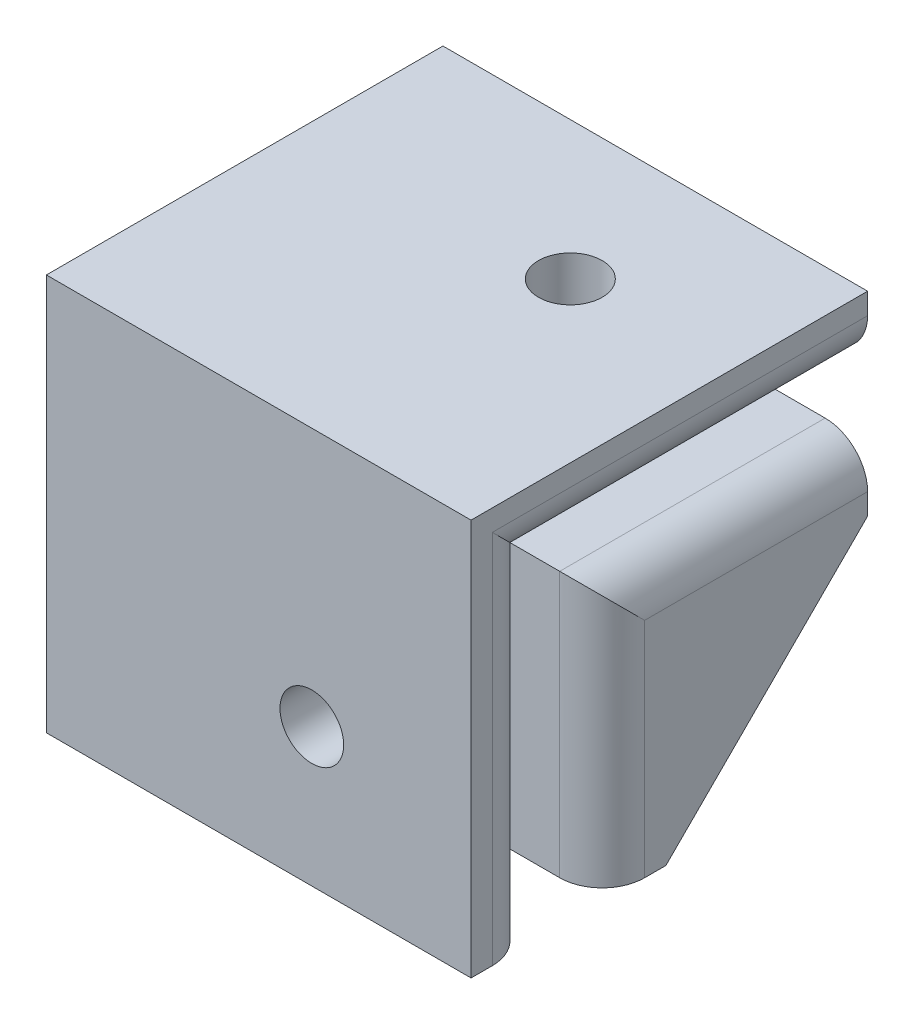
ISO-10303-21;
HEADER;
FILE_DESCRIPTION(('STEP AP214'),'2;1');
FILE_NAME('part.step','',(''),(''),'','','');
FILE_SCHEMA(('AUTOMOTIVE_DESIGN { 1 0 10303 214 1 1 1 1 }'));
ENDSEC;
DATA;
#1=APPLICATION_CONTEXT('core data for automotive mechanical design processes');
#2=APPLICATION_PROTOCOL_DEFINITION('international standard','automotive_design',2000,#1);
#3=PRODUCT_CONTEXT('',#1,'mechanical');
#4=PRODUCT('Part','Part','',(#3));
#5=PRODUCT_RELATED_PRODUCT_CATEGORY('part','',(#4));
#6=PRODUCT_DEFINITION_FORMATION('','',#4);
#7=PRODUCT_DEFINITION_CONTEXT('part definition',#1,'design');
#8=PRODUCT_DEFINITION('design','',#6,#7);
#9=PRODUCT_DEFINITION_SHAPE('','',#8);
#10=(LENGTH_UNIT() NAMED_UNIT(*) SI_UNIT(.MILLI.,.METRE.));
#11=(NAMED_UNIT(*) PLANE_ANGLE_UNIT() SI_UNIT($,.RADIAN.));
#12=(NAMED_UNIT(*) SI_UNIT($,.STERADIAN.) SOLID_ANGLE_UNIT());
#13=UNCERTAINTY_MEASURE_WITH_UNIT(LENGTH_MEASURE(1.E-05),#10,'distance_accuracy_value','');
#14=(GEOMETRIC_REPRESENTATION_CONTEXT(3) GLOBAL_UNCERTAINTY_ASSIGNED_CONTEXT((#13)) GLOBAL_UNIT_ASSIGNED_CONTEXT((#10,
#11,#12)) REPRESENTATION_CONTEXT('',''));
#15=CARTESIAN_POINT('',(0.,0.,0.));
#16=DIRECTION('',(0.,0.,1.));
#17=DIRECTION('',(1.,0.,0.));
#18=AXIS2_PLACEMENT_3D('',#15,#16,#17);
#19=CARTESIAN_POINT('',(12.5686292517777,-12.7041207821482,-6.07412073804247));
#20=DIRECTION('',(0.,1.,0.));
#21=DIRECTION('',(0.,0.,1.));
#22=AXIS2_PLACEMENT_3D('',#19,#20,#21);
#23=CYLINDRICAL_SURFACE('',#22,1.53);
#24=CARTESIAN_POINT('',(12.5686292517777,0.0458792178518012,-6.07412073804247));
#25=DIRECTION('',(0.,-1.,0.));
#26=DIRECTION('',(0.,0.,-1.));
#27=AXIS2_PLACEMENT_3D('',#24,#25,#26);
#28=CIRCLE('',#27,1.53);
#29=CARTESIAN_POINT('',(12.5686292517777,0.0458792178518012,-7.60412073804247));
#30=VERTEX_POINT('',#29);
#31=EDGE_CURVE('E165',#30,#30,#28,.T.);
#32=ORIENTED_EDGE('',*,*,#31,.F.);
#33=EDGE_LOOP('',(#32));
#34=FACE_BOUND('',#33,.T.);
#35=CARTESIAN_POINT('',(12.5686292517777,-6.0741207821482,-6.07412073804247));
#36=DIRECTION('',(0.,0.707106781186548,-0.707106781186547));
#37=DIRECTION('',(0.,0.707106781186547,0.707106781186548));
#38=AXIS2_PLACEMENT_3D('',#35,#36,#37);
#39=ELLIPSE('',#38,2.16374675043084,1.53);
#40=CARTESIAN_POINT('',(14.0986292517777,-6.0741207821482,-6.07412073804247));
#41=VERTEX_POINT('',#40);
#42=CARTESIAN_POINT('',(11.0386292517777,-6.0741207821482,-6.07412073804247));
#43=VERTEX_POINT('',#42);
#44=EDGE_CURVE('E52',#41,#43,#39,.F.);
#45=ORIENTED_EDGE('',*,*,#44,.T.);
#46=CARTESIAN_POINT('',(12.5686292517777,-6.0741207821482,-6.07412073804247));
#47=DIRECTION('',(0.,0.707106781186547,0.707106781186548));
#48=DIRECTION('',(0.,0.707106781186548,-0.707106781186547));
#49=AXIS2_PLACEMENT_3D('',#46,#47,#48);
#50=ELLIPSE('',#49,2.16374675043084,1.53);
#51=EDGE_CURVE('E11',#43,#41,#50,.F.);
#52=ORIENTED_EDGE('',*,*,#51,.T.);
#53=EDGE_LOOP('',(#45,#52));
#54=FACE_BOUND('',#53,.T.);
#55=ADVANCED_FACE('F38',(#34,#54),#23,.F.);
#56=CARTESIAN_POINT('',(20.2186292517777,0.0458792178518012,0.0458792619575329));
#57=DIRECTION('',(1.,0.,0.));
#58=DIRECTION('',(0.,0.,-1.));
#59=AXIS2_PLACEMENT_3D('',#56,#57,#58);
#60=PLANE('',#59);
#61=DIRECTION('',(0.,0.,-1.));
#62=VECTOR('',#61,1.);
#63=CARTESIAN_POINT('',(20.2186292517777,-12.7041207821482,0.0458792619575314));
#64=LINE('',#63,#62);
#65=CARTESIAN_POINT('',(20.2186292517777,-12.7041207821482,6.34437926195753));
#66=VERTEX_POINT('',#65);
#67=CARTESIAN_POINT('',(20.2186292517777,-12.7041207821482,5.32437926195753));
#68=VERTEX_POINT('',#67);
#69=EDGE_CURVE('E270',#66,#68,#64,.T.);
#70=ORIENTED_EDGE('',*,*,#69,.T.);
#71=DIRECTION('',(0.,-1.,0.));
#72=VECTOR('',#71,1.);
#73=CARTESIAN_POINT('',(20.2186292517777,3.2843792178518,5.32437926195753));
#74=LINE('',#73,#72);
#75=CARTESIAN_POINT('',(20.2186292517777,5.3243792178518,5.32437926195753));
#76=VERTEX_POINT('',#75);
#77=EDGE_CURVE('E200',#68,#76,#74,.F.);
#78=ORIENTED_EDGE('',*,*,#77,.T.);
#79=DIRECTION('',(0.,0.,1.));
#80=VECTOR('',#79,1.);
#81=CARTESIAN_POINT('',(20.2186292517777,5.3243792178518,-12.7041207380425));
#82=LINE('',#81,#80);
#83=CARTESIAN_POINT('',(20.2186292517777,5.3243792178518,-12.7041207380425));
#84=VERTEX_POINT('',#83);
#85=EDGE_CURVE('E203',#76,#84,#82,.F.);
#86=ORIENTED_EDGE('',*,*,#85,.T.);
#87=DIRECTION('',(0.,1.,0.));
#88=VECTOR('',#87,1.);
#89=CARTESIAN_POINT('',(20.2186292517777,-3.0141207821482,-12.7041207380425));
#90=LINE('',#89,#88);
#91=CARTESIAN_POINT('',(20.2186292517777,6.3443792178518,-12.7041207380425));
#92=VERTEX_POINT('',#91);
#93=EDGE_CURVE('E266',#84,#92,#90,.T.);
#94=ORIENTED_EDGE('',*,*,#93,.T.);
#95=DIRECTION('',(0.,0.,1.));
#96=VECTOR('',#95,1.);
#97=CARTESIAN_POINT('',(20.2186292517777,6.3443792178518,-12.7041207380425));
#98=LINE('',#97,#96);
#99=CARTESIAN_POINT('',(20.2186292517777,6.3443792178518,6.34437926195753));
#100=VERTEX_POINT('',#99);
#101=EDGE_CURVE('E259',#92,#100,#98,.T.);
#102=ORIENTED_EDGE('',*,*,#101,.T.);
#103=DIRECTION('',(0.,-1.,0.));
#104=VECTOR('',#103,1.);
#105=CARTESIAN_POINT('',(20.2186292517777,6.3443792178518,6.34437926195753));
#106=LINE('',#105,#104);
#107=EDGE_CURVE('E236',#100,#66,#106,.T.);
#108=ORIENTED_EDGE('',*,*,#107,.T.);
#109=EDGE_LOOP('',(#70,#78,#86,#94,#102,#108));
#110=FACE_BOUND('',#109,.T.);
#111=ADVANCED_FACE('F364',(#110),#60,.T.);
#112=CARTESIAN_POINT('',(20.2186292517777,-12.7041207821482,-3.01412073804247));
#113=DIRECTION('',(0.,0.707106781186547,0.707106781186548));
#114=DIRECTION('',(0.,-0.707106781186548,0.707106781186547));
#115=AXIS2_PLACEMENT_3D('',#112,#113,#114);
#116=PLANE('',#115);
#117=CARTESIAN_POINT('',(12.5686292517777,-6.0741207821482,-9.64412073804247));
#118=DIRECTION('',(0.,0.707106781186547,0.707106781186548));
#119=DIRECTION('',(0.,-0.707106781186548,0.707106781186547));
#120=AXIS2_PLACEMENT_3D('',#117,#118,#119);
#121=ELLIPSE('',#120,2.16374675043084,1.53);
#122=CARTESIAN_POINT('',(12.5686292517777,-7.6041207821482,-8.11412073804247));
#123=VERTEX_POINT('',#122);
#124=EDGE_CURVE('E327',#123,#123,#121,.T.);
#125=ORIENTED_EDGE('',*,*,#124,.T.);
#126=EDGE_LOOP('',(#125));
#127=FACE_BOUND('',#126,.T.);
#128=CARTESIAN_POINT('',(12.5686292517777,-9.6441207821482,-6.07412073804247));
#129=DIRECTION('',(0.,0.707106781186547,0.707106781186548));
#130=DIRECTION('',(0.,0.707106781186548,-0.707106781186547));
#131=AXIS2_PLACEMENT_3D('',#128,#129,#130);
#132=ELLIPSE('',#131,2.16374675043084,1.53);
#133=CARTESIAN_POINT('',(12.5686292517777,-8.1141207821482,-7.60412073804247));
#134=VERTEX_POINT('',#133);
#135=EDGE_CURVE('E175',#134,#134,#132,.T.);
#136=ORIENTED_EDGE('',*,*,#135,.T.);
#137=EDGE_LOOP('',(#136));
#138=FACE_BOUND('',#137,.T.);
#139=DIRECTION('',(0.,0.707106781186548,-0.707106781186547));
#140=VECTOR('',#139,1.);
#141=CARTESIAN_POINT('',(-0.181370748222278,-12.7041207821482,-3.01412073804247));
#142=LINE('',#141,#140);
#143=CARTESIAN_POINT('',(-0.181370748222278,-12.7041207821482,-3.01412073804247));
#144=VERTEX_POINT('',#143);
#145=CARTESIAN_POINT('',(-0.181370748222278,-3.0141207821482,-12.7041207380425));
#146=VERTEX_POINT('',#145);
#147=EDGE_CURVE('E251',#144,#146,#142,.T.);
#148=ORIENTED_EDGE('',*,*,#147,.T.);
#149=DIRECTION('',(-1.,0.,0.));
#150=VECTOR('',#149,1.);
#151=CARTESIAN_POINT('',(20.2186292517777,-3.0141207821482,-12.7041207380425));
#152=LINE('',#151,#150);
#153=CARTESIAN_POINT('',(20.2186292517777,-3.0141207821482,-12.7041207380425));
#154=VERTEX_POINT('',#153);
#155=EDGE_CURVE('E220',#154,#146,#152,.T.);
#156=ORIENTED_EDGE('',*,*,#155,.F.);
#157=DIRECTION('',(0.,0.707106781186548,-0.707106781186547));
#158=VECTOR('',#157,1.);
#159=CARTESIAN_POINT('',(20.2186292517777,-12.7041207821482,-3.01412073804247));
#160=LINE('',#159,#158);
#161=CARTESIAN_POINT('',(20.2186292517777,-12.7041207821482,-3.01412073804247));
#162=VERTEX_POINT('',#161);
#163=EDGE_CURVE('E267',#162,#154,#160,.T.);
#164=ORIENTED_EDGE('',*,*,#163,.F.);
#165=DIRECTION('',(-1.,0.,0.));
#166=VECTOR('',#165,1.);
#167=CARTESIAN_POINT('',(20.2186292517777,-12.7041207821482,-3.01412073804247));
#168=LINE('',#167,#166);
#169=EDGE_CURVE('E216',#162,#144,#168,.T.);
#170=ORIENTED_EDGE('',*,*,#169,.T.);
#171=EDGE_LOOP('',(#148,#156,#164,#170));
#172=FACE_BOUND('',#171,.T.);
#173=ADVANCED_FACE('F371',(#127,#138,#172),#116,.F.);
#174=CARTESIAN_POINT('',(20.2186292517777,3.2843792178518,-12.7041207380425));
#175=DIRECTION('',(0.,0.,1.));
#176=DIRECTION('',(1.,0.,0.));
#177=AXIS2_PLACEMENT_3D('',#174,#175,#176);
#178=PLANE('',#177);
#179=DIRECTION('',(1.,0.,0.));
#180=VECTOR('',#179,1.);
#181=CARTESIAN_POINT('',(4.91862925177772,0.0458792178518012,-12.7041207380425));
#182=LINE('',#181,#180);
#183=CARTESIAN_POINT('',(4.91862925177772,0.0458792178518012,-12.7041207380425));
#184=VERTEX_POINT('',#183);
#185=CARTESIAN_POINT('',(18.1786292517777,0.0458792178518012,-12.7041207380425));
#186=VERTEX_POINT('',#185);
#187=EDGE_CURVE('E287',#184,#186,#182,.T.);
#188=ORIENTED_EDGE('',*,*,#187,.T.);
#189=CARTESIAN_POINT('',(18.1786292517777,-1.9941207821482,-12.7041207380425));
#190=DIRECTION('',(0.,0.,1.));
#191=DIRECTION('',(1.,0.,0.));
#192=AXIS2_PLACEMENT_3D('',#189,#190,#191);
#193=CIRCLE('',#192,2.04);
#194=CARTESIAN_POINT('',(20.2186292517777,-1.9941207821482,-12.7041207380425));
#195=VERTEX_POINT('',#194);
#196=EDGE_CURVE('E182',#186,#195,#193,.F.);
#197=ORIENTED_EDGE('',*,*,#196,.T.);
#198=EDGE_CURVE('E262',#154,#195,#90,.T.);
#199=ORIENTED_EDGE('',*,*,#198,.F.);
#200=ORIENTED_EDGE('',*,*,#155,.T.);
#201=DIRECTION('',(0.,1.,0.));
#202=VECTOR('',#201,1.);
#203=CARTESIAN_POINT('',(-0.181370748222278,3.2843792178518,-12.7041207380425));
#204=LINE('',#203,#202);
#205=CARTESIAN_POINT('',(-0.181370748222278,6.3443792178518,-12.7041207380425));
#206=VERTEX_POINT('',#205);
#207=EDGE_CURVE('E248',#146,#206,#204,.T.);
#208=ORIENTED_EDGE('',*,*,#207,.T.);
#209=DIRECTION('',(-1.,0.,0.));
#210=VECTOR('',#209,1.);
#211=CARTESIAN_POINT('',(20.2186292517777,6.3443792178518,-12.7041207380425));
#212=LINE('',#211,#210);
#213=EDGE_CURVE('E224',#92,#206,#212,.T.);
#214=ORIENTED_EDGE('',*,*,#213,.F.);
#215=ORIENTED_EDGE('',*,*,#93,.F.);
#216=CARTESIAN_POINT('',(18.1786292517777,5.3243792178518,-12.7041207380425));
#217=DIRECTION('',(0.,0.,1.));
#218=DIRECTION('',(1.,0.,0.));
#219=AXIS2_PLACEMENT_3D('',#216,#217,#218);
#220=CIRCLE('',#219,2.04);
#221=CARTESIAN_POINT('',(18.1786292517777,3.2843792178518,-12.7041207380425));
#222=VERTEX_POINT('',#221);
#223=EDGE_CURVE('E60',#84,#222,#220,.F.);
#224=ORIENTED_EDGE('',*,*,#223,.T.);
#225=DIRECTION('',(1.,0.,0.));
#226=VECTOR('',#225,1.);
#227=CARTESIAN_POINT('',(4.91862925177772,3.2843792178518,-12.7041207380425));
#228=LINE('',#227,#226);
#229=CARTESIAN_POINT('',(4.91862925177772,3.2843792178518,-12.7041207380425));
#230=VERTEX_POINT('',#229);
#231=EDGE_CURVE('E291',#230,#222,#228,.T.);
#232=ORIENTED_EDGE('',*,*,#231,.F.);
#233=DIRECTION('',(0.,1.,0.));
#234=VECTOR('',#233,1.);
#235=CARTESIAN_POINT('',(4.91862925177772,0.0458792178518012,-12.7041207380425));
#236=LINE('',#235,#234);
#237=EDGE_CURVE('E300',#184,#230,#236,.T.);
#238=ORIENTED_EDGE('',*,*,#237,.F.);
#239=EDGE_LOOP('',(#188,#197,#199,#200,#208,#214,#215,#224,#232,#238));
#240=FACE_BOUND('',#239,.T.);
#241=ADVANCED_FACE('F374',(#240),#178,.F.);
#242=CARTESIAN_POINT('',(20.2186292517777,6.3443792178518,-12.7041207380425));
#243=DIRECTION('',(0.,-1.,0.));
#244=DIRECTION('',(0.,0.,-1.));
#245=AXIS2_PLACEMENT_3D('',#242,#243,#244);
#246=PLANE('',#245);
#247=CARTESIAN_POINT('',(12.5686292517777,6.3443792178518,-6.07412073804247));
#248=DIRECTION('',(0.,1.,0.));
#249=DIRECTION('',(0.,0.,1.));
#250=AXIS2_PLACEMENT_3D('',#247,#248,#249);
#251=CIRCLE('',#250,1.53);
#252=CARTESIAN_POINT('',(12.5686292517777,6.3443792178518,-4.54412073804247));
#253=VERTEX_POINT('',#252);
#254=EDGE_CURVE('E170',#253,#253,#251,.T.);
#255=ORIENTED_EDGE('',*,*,#254,.F.);
#256=EDGE_LOOP('',(#255));
#257=FACE_BOUND('',#256,.T.);
#258=DIRECTION('',(0.,0.,1.));
#259=VECTOR('',#258,1.);
#260=CARTESIAN_POINT('',(-0.181370748222278,6.3443792178518,-12.7041207380425));
#261=LINE('',#260,#259);
#262=CARTESIAN_POINT('',(-0.181370748222278,6.3443792178518,6.34437926195753));
#263=VERTEX_POINT('',#262);
#264=EDGE_CURVE('E245',#206,#263,#261,.T.);
#265=ORIENTED_EDGE('',*,*,#264,.T.);
#266=DIRECTION('',(-1.,0.,0.));
#267=VECTOR('',#266,1.);
#268=CARTESIAN_POINT('',(20.2186292517777,6.3443792178518,6.34437926195753));
#269=LINE('',#268,#267);
#270=EDGE_CURVE('E228',#100,#263,#269,.T.);
#271=ORIENTED_EDGE('',*,*,#270,.F.);
#272=ORIENTED_EDGE('',*,*,#101,.F.);
#273=ORIENTED_EDGE('',*,*,#213,.T.);
#274=EDGE_LOOP('',(#265,#271,#272,#273));
#275=FACE_BOUND('',#274,.T.);
#276=ADVANCED_FACE('F351',(#257,#275),#246,.F.);
#277=CARTESIAN_POINT('',(20.2186292517777,6.3443792178518,6.34437926195753));
#278=DIRECTION('',(0.,0.,-1.));
#279=DIRECTION('',(0.,1.,0.));
#280=AXIS2_PLACEMENT_3D('',#277,#278,#279);
#281=PLANE('',#280);
#282=CARTESIAN_POINT('',(12.5686292517777,-6.0741207821482,6.34437926195753));
#283=DIRECTION('',(0.,0.,1.));
#284=DIRECTION('',(1.,0.,0.));
#285=AXIS2_PLACEMENT_3D('',#282,#283,#284);
#286=CIRCLE('',#285,1.53);
#287=CARTESIAN_POINT('',(14.0986292517777,-6.0741207821482,6.34437926195753));
#288=VERTEX_POINT('',#287);
#289=EDGE_CURVE('E339',#288,#288,#286,.T.);
#290=ORIENTED_EDGE('',*,*,#289,.F.);
#291=EDGE_LOOP('',(#290));
#292=FACE_BOUND('',#291,.T.);
#293=DIRECTION('',(0.,-1.,0.));
#294=VECTOR('',#293,1.);
#295=CARTESIAN_POINT('',(-0.181370748222278,6.3443792178518,6.34437926195753));
#296=LINE('',#295,#294);
#297=CARTESIAN_POINT('',(-0.181370748222278,-12.7041207821482,6.34437926195753));
#298=VERTEX_POINT('',#297);
#299=EDGE_CURVE('E241',#263,#298,#296,.T.);
#300=ORIENTED_EDGE('',*,*,#299,.T.);
#301=DIRECTION('',(-1.,0.,0.));
#302=VECTOR('',#301,1.);
#303=CARTESIAN_POINT('',(20.2186292517777,-12.7041207821482,6.34437926195753));
#304=LINE('',#303,#302);
#305=EDGE_CURVE('E232',#66,#298,#304,.T.);
#306=ORIENTED_EDGE('',*,*,#305,.F.);
#307=ORIENTED_EDGE('',*,*,#107,.F.);
#308=ORIENTED_EDGE('',*,*,#270,.T.);
#309=EDGE_LOOP('',(#300,#306,#307,#308));
#310=FACE_BOUND('',#309,.T.);
#311=ADVANCED_FACE('F347',(#292,#310),#281,.F.);
#312=CARTESIAN_POINT('',(20.2186292517777,-12.7041207821482,0.0458792619575314));
#313=DIRECTION('',(0.,1.,0.));
#314=DIRECTION('',(0.,0.,1.));
#315=AXIS2_PLACEMENT_3D('',#312,#313,#314);
#316=PLANE('',#315);
#317=DIRECTION('',(1.,0.,0.));
#318=VECTOR('',#317,1.);
#319=CARTESIAN_POINT('',(4.91862925177772,-12.7041207821482,3.28437926195753));
#320=LINE('',#319,#318);
#321=CARTESIAN_POINT('',(4.91862925177772,-12.7041207821482,3.28437926195753));
#322=VERTEX_POINT('',#321);
#323=CARTESIAN_POINT('',(18.1786292517777,-12.7041207821482,3.28437926195753));
#324=VERTEX_POINT('',#323);
#325=EDGE_CURVE('E274',#322,#324,#320,.T.);
#326=ORIENTED_EDGE('',*,*,#325,.T.);
#327=CARTESIAN_POINT('',(18.1786292517777,-12.7041207821482,5.32437926195753));
#328=DIRECTION('',(0.,1.,0.));
#329=DIRECTION('',(0.,0.,1.));
#330=AXIS2_PLACEMENT_3D('',#327,#328,#329);
#331=CIRCLE('',#330,2.04);
#332=EDGE_CURVE('E206',#324,#68,#331,.F.);
#333=ORIENTED_EDGE('',*,*,#332,.T.);
#334=ORIENTED_EDGE('',*,*,#69,.F.);
#335=ORIENTED_EDGE('',*,*,#305,.T.);
#336=DIRECTION('',(0.,0.,-1.));
#337=VECTOR('',#336,1.);
#338=CARTESIAN_POINT('',(-0.181370748222278,-12.7041207821482,0.0458792619575314));
#339=LINE('',#338,#337);
#340=EDGE_CURVE('E237',#298,#144,#339,.T.);
#341=ORIENTED_EDGE('',*,*,#340,.T.);
#342=ORIENTED_EDGE('',*,*,#169,.F.);
#343=CARTESIAN_POINT('',(20.2186292517777,-12.7041207821482,-1.99412073804247));
#344=VERTEX_POINT('',#343);
#345=EDGE_CURVE('E240',#344,#162,#64,.T.);
#346=ORIENTED_EDGE('',*,*,#345,.F.);
#347=CARTESIAN_POINT('',(18.1786292517777,-12.7041207821482,-1.99412073804247));
#348=DIRECTION('',(0.,1.,0.));
#349=DIRECTION('',(0.,0.,1.));
#350=AXIS2_PLACEMENT_3D('',#347,#348,#349);
#351=CIRCLE('',#350,2.04);
#352=CARTESIAN_POINT('',(18.1786292517777,-12.7041207821482,0.0458792619575314));
#353=VERTEX_POINT('',#352);
#354=EDGE_CURVE('E209',#344,#353,#351,.F.);
#355=ORIENTED_EDGE('',*,*,#354,.T.);
#356=DIRECTION('',(1.,0.,0.));
#357=VECTOR('',#356,1.);
#358=CARTESIAN_POINT('',(4.91862925177772,-12.7041207821482,0.0458792619575314));
#359=LINE('',#358,#357);
#360=CARTESIAN_POINT('',(4.91862925177772,-12.7041207821482,0.0458792619575314));
#361=VERTEX_POINT('',#360);
#362=EDGE_CURVE('E278',#361,#353,#359,.T.);
#363=ORIENTED_EDGE('',*,*,#362,.F.);
#364=DIRECTION('',(0.,0.,-1.));
#365=VECTOR('',#364,1.);
#366=CARTESIAN_POINT('',(4.91862925177772,-12.7041207821482,3.28437926195753));
#367=LINE('',#366,#365);
#368=EDGE_CURVE('E311',#322,#361,#367,.T.);
#369=ORIENTED_EDGE('',*,*,#368,.F.);
#370=EDGE_LOOP('',(#326,#333,#334,#335,#341,#342,#346,#355,#363,#369));
#371=FACE_BOUND('',#370,.T.);
#372=ADVANCED_FACE('F350',(#371),#316,.F.);
#373=DIRECTION('',(0.,0.,-1.));
#374=VECTOR('',#373,1.);
#375=CARTESIAN_POINT('',(20.2186292517777,-1.9941207821482,0.0458792619575329));
#376=LINE('',#375,#374);
#377=CARTESIAN_POINT('',(20.2186292517777,-1.9941207821482,-1.99412073804247));
#378=VERTEX_POINT('',#377);
#379=EDGE_CURVE('E193',#195,#378,#376,.F.);
#380=ORIENTED_EDGE('',*,*,#379,.T.);
#381=DIRECTION('',(0.,1.,0.));
#382=VECTOR('',#381,1.);
#383=CARTESIAN_POINT('',(20.2186292517777,-12.7041207821482,-1.99412073804247));
#384=LINE('',#383,#382);
#385=EDGE_CURVE('E190',#378,#344,#384,.F.);
#386=ORIENTED_EDGE('',*,*,#385,.T.);
#387=ORIENTED_EDGE('',*,*,#345,.T.);
#388=ORIENTED_EDGE('',*,*,#163,.T.);
#389=ORIENTED_EDGE('',*,*,#198,.T.);
#390=EDGE_LOOP('',(#380,#386,#387,#388,#389));
#391=FACE_BOUND('',#390,.T.);
#392=ADVANCED_FACE('F378',(#391),#60,.T.);
#393=CARTESIAN_POINT('',(-0.181370748222278,0.0458792178518012,0.0458792619575329));
#394=DIRECTION('',(1.,0.,0.));
#395=DIRECTION('',(0.,0.,-1.));
#396=AXIS2_PLACEMENT_3D('',#393,#394,#395);
#397=PLANE('',#396);
#398=ORIENTED_EDGE('',*,*,#147,.F.);
#399=ORIENTED_EDGE('',*,*,#340,.F.);
#400=ORIENTED_EDGE('',*,*,#299,.F.);
#401=ORIENTED_EDGE('',*,*,#264,.F.);
#402=ORIENTED_EDGE('',*,*,#207,.F.);
#403=EDGE_LOOP('',(#398,#399,#400,#401,#402));
#404=FACE_BOUND('',#403,.T.);
#405=ADVANCED_FACE('F368',(#404),#397,.F.);
#406=CARTESIAN_POINT('',(4.91862925177772,3.2843792178518,3.28437926195753));
#407=DIRECTION('',(0.,0.,1.));
#408=DIRECTION('',(0.,-1.,0.));
#409=AXIS2_PLACEMENT_3D('',#406,#407,#408);
#410=PLANE('',#409);
#411=CARTESIAN_POINT('',(12.5686292517777,-6.0741207821482,3.28437926195753));
#412=DIRECTION('',(0.,0.,1.));
#413=DIRECTION('',(0.,-1.,0.));
#414=AXIS2_PLACEMENT_3D('',#411,#412,#413);
#415=CIRCLE('',#414,1.53);
#416=CARTESIAN_POINT('',(12.5686292517777,-7.6041207821482,3.28437926195753));
#417=VERTEX_POINT('',#416);
#418=EDGE_CURVE('E331',#417,#417,#415,.T.);
#419=ORIENTED_EDGE('',*,*,#418,.T.);
#420=EDGE_LOOP('',(#419));
#421=FACE_BOUND('',#420,.T.);
#422=DIRECTION('',(1.,0.,0.));
#423=VECTOR('',#422,1.);
#424=CARTESIAN_POINT('',(4.91862925177772,3.2843792178518,3.28437926195753));
#425=LINE('',#424,#423);
#426=CARTESIAN_POINT('',(4.91862925177772,3.2843792178518,3.28437926195753));
#427=VERTEX_POINT('',#426);
#428=CARTESIAN_POINT('',(18.1786292517777,3.2843792178518,3.28437926195753));
#429=VERTEX_POINT('',#428);
#430=EDGE_CURVE('E255',#427,#429,#425,.T.);
#431=ORIENTED_EDGE('',*,*,#430,.T.);
#432=DIRECTION('',(0.,-1.,0.));
#433=VECTOR('',#432,1.);
#434=CARTESIAN_POINT('',(18.1786292517777,-12.7041207821482,3.28437926195753));
#435=LINE('',#434,#433);
#436=EDGE_CURVE('E212',#429,#324,#435,.T.);
#437=ORIENTED_EDGE('',*,*,#436,.T.);
#438=ORIENTED_EDGE('',*,*,#325,.F.);
#439=DIRECTION('',(0.,-1.,0.));
#440=VECTOR('',#439,1.);
#441=CARTESIAN_POINT('',(4.91862925177772,3.2843792178518,3.28437926195753));
#442=LINE('',#441,#440);
#443=EDGE_CURVE('E179',#427,#322,#442,.T.);
#444=ORIENTED_EDGE('',*,*,#443,.F.);
#445=EDGE_LOOP('',(#431,#437,#438,#444));
#446=FACE_BOUND('',#445,.T.);
#447=ADVANCED_FACE('F399',(#421,#446),#410,.F.);
#448=CARTESIAN_POINT('',(4.91862925177772,3.2843792178518,-12.7041207380425));
#449=DIRECTION('',(0.,1.,0.));
#450=DIRECTION('',(0.,0.,1.));
#451=AXIS2_PLACEMENT_3D('',#448,#449,#450);
#452=PLANE('',#451);
#453=CARTESIAN_POINT('',(12.5686292517777,3.2843792178518,-6.07412073804247));
#454=DIRECTION('',(0.,1.,0.));
#455=DIRECTION('',(0.,0.,1.));
#456=AXIS2_PLACEMENT_3D('',#453,#454,#455);
#457=CIRCLE('',#456,1.53);
#458=CARTESIAN_POINT('',(12.5686292517777,3.2843792178518,-4.54412073804247));
#459=VERTEX_POINT('',#458);
#460=EDGE_CURVE('E169',#459,#459,#457,.T.);
#461=ORIENTED_EDGE('',*,*,#460,.T.);
#462=EDGE_LOOP('',(#461));
#463=FACE_BOUND('',#462,.T.);
#464=ORIENTED_EDGE('',*,*,#231,.T.);
#465=DIRECTION('',(0.,0.,1.));
#466=VECTOR('',#465,1.);
#467=CARTESIAN_POINT('',(18.1786292517777,3.2843792178518,3.28437926195753));
#468=LINE('',#467,#466);
#469=EDGE_CURVE('E159',#222,#429,#468,.T.);
#470=ORIENTED_EDGE('',*,*,#469,.T.);
#471=ORIENTED_EDGE('',*,*,#430,.F.);
#472=DIRECTION('',(0.,0.,1.));
#473=VECTOR('',#472,1.);
#474=CARTESIAN_POINT('',(4.91862925177772,3.2843792178518,-12.7041207380425));
#475=LINE('',#474,#473);
#476=EDGE_CURVE('E279',#230,#427,#475,.T.);
#477=ORIENTED_EDGE('',*,*,#476,.F.);
#478=EDGE_LOOP('',(#464,#470,#471,#477));
#479=FACE_BOUND('',#478,.T.);
#480=ADVANCED_FACE('F409',(#463,#479),#452,.F.);
#481=CARTESIAN_POINT('',(4.91862925177772,0.0458792178518012,0.0458792619575329));
#482=DIRECTION('',(0.,-1.,0.));
#483=DIRECTION('',(0.,0.,-1.));
#484=AXIS2_PLACEMENT_3D('',#481,#482,#483);
#485=PLANE('',#484);
#486=ORIENTED_EDGE('',*,*,#31,.T.);
#487=EDGE_LOOP('',(#486));
#488=FACE_BOUND('',#487,.T.);
#489=DIRECTION('',(1.,0.,0.));
#490=VECTOR('',#489,1.);
#491=CARTESIAN_POINT('',(4.91862925177772,0.0458792178518012,0.0458792619575329));
#492=LINE('',#491,#490);
#493=CARTESIAN_POINT('',(4.91862925177772,0.0458792178518012,0.0458792619575329));
#494=VERTEX_POINT('',#493);
#495=CARTESIAN_POINT('',(18.1786292517777,0.0458792178518012,0.0458792619575329));
#496=VERTEX_POINT('',#495);
#497=EDGE_CURVE('E283',#494,#496,#492,.T.);
#498=ORIENTED_EDGE('',*,*,#497,.T.);
#499=DIRECTION('',(0.,0.,-1.));
#500=VECTOR('',#499,1.);
#501=CARTESIAN_POINT('',(18.1786292517777,0.0458792178518012,-12.7041207380425));
#502=LINE('',#501,#500);
#503=EDGE_CURVE('E187',#496,#186,#502,.T.);
#504=ORIENTED_EDGE('',*,*,#503,.T.);
#505=ORIENTED_EDGE('',*,*,#187,.F.);
#506=DIRECTION('',(0.,0.,-1.));
#507=VECTOR('',#506,1.);
#508=CARTESIAN_POINT('',(4.91862925177772,0.0458792178518012,0.0458792619575329));
#509=LINE('',#508,#507);
#510=EDGE_CURVE('E303',#494,#184,#509,.T.);
#511=ORIENTED_EDGE('',*,*,#510,.F.);
#512=EDGE_LOOP('',(#498,#504,#505,#511));
#513=FACE_BOUND('',#512,.T.);
#514=ADVANCED_FACE('F413',(#488,#513),#485,.F.);
#515=CARTESIAN_POINT('',(4.91862925177772,-12.7041207821482,0.0458792619575314));
#516=DIRECTION('',(0.,0.,-1.));
#517=DIRECTION('',(0.,1.,0.));
#518=AXIS2_PLACEMENT_3D('',#515,#516,#517);
#519=PLANE('',#518);
#520=CARTESIAN_POINT('',(12.5686292517777,-6.0741207821482,0.0458792619575312));
#521=DIRECTION('',(0.,0.,-1.));
#522=DIRECTION('',(0.,1.,0.));
#523=AXIS2_PLACEMENT_3D('',#520,#521,#522);
#524=CIRCLE('',#523,1.53);
#525=CARTESIAN_POINT('',(12.5686292517777,-4.5441207821482,0.0458792619575314));
#526=VERTEX_POINT('',#525);
#527=EDGE_CURVE('E335',#526,#526,#524,.T.);
#528=ORIENTED_EDGE('',*,*,#527,.T.);
#529=EDGE_LOOP('',(#528));
#530=FACE_BOUND('',#529,.T.);
#531=ORIENTED_EDGE('',*,*,#362,.T.);
#532=DIRECTION('',(0.,1.,0.));
#533=VECTOR('',#532,1.);
#534=CARTESIAN_POINT('',(18.1786292517777,0.045879217851801,0.0458792619575329));
#535=LINE('',#534,#533);
#536=EDGE_CURVE('E196',#353,#496,#535,.T.);
#537=ORIENTED_EDGE('',*,*,#536,.T.);
#538=ORIENTED_EDGE('',*,*,#497,.F.);
#539=DIRECTION('',(0.,1.,0.));
#540=VECTOR('',#539,1.);
#541=CARTESIAN_POINT('',(4.91862925177772,-12.7041207821482,0.0458792619575314));
#542=LINE('',#541,#540);
#543=EDGE_CURVE('E307',#361,#494,#542,.T.);
#544=ORIENTED_EDGE('',*,*,#543,.F.);
#545=EDGE_LOOP('',(#531,#537,#538,#544));
#546=FACE_BOUND('',#545,.T.);
#547=ADVANCED_FACE('F393',(#530,#546),#519,.F.);
#548=CARTESIAN_POINT('',(4.91862925177772,0.0458792178518012,0.0458792619575329));
#549=DIRECTION('',(1.,0.,0.));
#550=DIRECTION('',(0.,0.,-1.));
#551=AXIS2_PLACEMENT_3D('',#548,#549,#550);
#552=PLANE('',#551);
#553=ORIENTED_EDGE('',*,*,#443,.T.);
#554=ORIENTED_EDGE('',*,*,#368,.T.);
#555=ORIENTED_EDGE('',*,*,#543,.T.);
#556=ORIENTED_EDGE('',*,*,#510,.T.);
#557=ORIENTED_EDGE('',*,*,#237,.T.);
#558=ORIENTED_EDGE('',*,*,#476,.T.);
#559=EDGE_LOOP('',(#553,#554,#555,#556,#557,#558));
#560=FACE_BOUND('',#559,.T.);
#561=ADVANCED_FACE('F396',(#560),#552,.T.);
#562=CARTESIAN_POINT('',(18.1786292517777,5.3243792178518,-12.7041207380425));
#563=DIRECTION('',(0.,0.,-1.));
#564=DIRECTION('',(-1.,0.,0.));
#565=AXIS2_PLACEMENT_3D('',#562,#563,#564);
#566=CYLINDRICAL_SURFACE('',#565,2.04);
#567=ORIENTED_EDGE('',*,*,#223,.F.);
#568=ORIENTED_EDGE('',*,*,#85,.F.);
#569=CARTESIAN_POINT('',(18.1786292517777,5.3243792178518,5.32437926195753));
#570=DIRECTION('',(0.,0.707106781186547,-0.707106781186547));
#571=DIRECTION('',(0.,0.707106781186547,0.707106781186547));
#572=AXIS2_PLACEMENT_3D('',#569,#570,#571);
#573=ELLIPSE('',#572,2.88499566724111,2.04);
#574=EDGE_CURVE('E174',#429,#76,#573,.F.);
#575=ORIENTED_EDGE('',*,*,#574,.F.);
#576=ORIENTED_EDGE('',*,*,#469,.F.);
#577=EDGE_LOOP('',(#567,#568,#575,#576));
#578=FACE_BOUND('',#577,.T.);
#579=ADVANCED_FACE('F406',(#578),#566,.T.);
#580=CARTESIAN_POINT('',(18.1786292517777,3.2843792178518,5.32437926195753));
#581=DIRECTION('',(0.,1.,0.));
#582=DIRECTION('',(0.,0.,1.));
#583=AXIS2_PLACEMENT_3D('',#580,#581,#582);
#584=CYLINDRICAL_SURFACE('',#583,2.04);
#585=ORIENTED_EDGE('',*,*,#574,.T.);
#586=ORIENTED_EDGE('',*,*,#77,.F.);
#587=ORIENTED_EDGE('',*,*,#332,.F.);
#588=ORIENTED_EDGE('',*,*,#436,.F.);
#589=EDGE_LOOP('',(#585,#586,#587,#588));
#590=FACE_BOUND('',#589,.T.);
#591=ADVANCED_FACE('F403',(#590),#584,.T.);
#592=CARTESIAN_POINT('',(18.1786292517777,-1.9941207821482,0.0458792619575329));
#593=DIRECTION('',(0.,0.,1.));
#594=DIRECTION('',(0.,-1.,0.));
#595=AXIS2_PLACEMENT_3D('',#592,#593,#594);
#596=CYLINDRICAL_SURFACE('',#595,2.04);
#597=ORIENTED_EDGE('',*,*,#196,.F.);
#598=ORIENTED_EDGE('',*,*,#503,.F.);
#599=CARTESIAN_POINT('',(18.1786292517777,-1.9941207821482,-1.99412073804247));
#600=DIRECTION('',(0.,-0.707106781186548,0.707106781186547));
#601=DIRECTION('',(0.,0.707106781186547,0.707106781186548));
#602=AXIS2_PLACEMENT_3D('',#599,#600,#601);
#603=ELLIPSE('',#602,2.88499566724111,2.04);
#604=EDGE_CURVE('E171',#378,#496,#603,.T.);
#605=ORIENTED_EDGE('',*,*,#604,.F.);
#606=ORIENTED_EDGE('',*,*,#379,.F.);
#607=EDGE_LOOP('',(#597,#598,#605,#606));
#608=FACE_BOUND('',#607,.T.);
#609=ADVANCED_FACE('F40',(#608),#596,.T.);
#610=CARTESIAN_POINT('',(18.1786292517777,-12.7041207821482,-1.99412073804247));
#611=DIRECTION('',(0.,-1.,0.));
#612=DIRECTION('',(0.,0.,-1.));
#613=AXIS2_PLACEMENT_3D('',#610,#611,#612);
#614=CYLINDRICAL_SURFACE('',#613,2.04);
#615=ORIENTED_EDGE('',*,*,#354,.F.);
#616=ORIENTED_EDGE('',*,*,#385,.F.);
#617=ORIENTED_EDGE('',*,*,#604,.T.);
#618=ORIENTED_EDGE('',*,*,#536,.F.);
#619=EDGE_LOOP('',(#615,#616,#617,#618));
#620=FACE_BOUND('',#619,.T.);
#621=ADVANCED_FACE('F386',(#620),#614,.T.);
#622=CARTESIAN_POINT('',(12.5686292517777,-6.0741207821482,-6.07412073804247));
#623=DIRECTION('',(0.,0.707106781186548,-0.707106781186547));
#624=DIRECTION('',(0.,0.707106781186547,0.707106781186548));
#625=AXIS2_PLACEMENT_3D('',#622,#623,#624);
#626=ELLIPSE('',#625,2.16374675043084,1.53);
#627=EDGE_CURVE('E148',#41,#43,#626,.T.);
#628=ORIENTED_EDGE('',*,*,#627,.T.);
#629=CARTESIAN_POINT('',(12.5686292517777,-6.0741207821482,-6.07412073804247));
#630=DIRECTION('',(0.,0.707106781186547,0.707106781186548));
#631=DIRECTION('',(0.,0.707106781186548,-0.707106781186547));
#632=AXIS2_PLACEMENT_3D('',#629,#630,#631);
#633=ELLIPSE('',#632,2.16374675043084,1.53);
#634=EDGE_CURVE('E47',#43,#41,#633,.T.);
#635=ORIENTED_EDGE('',*,*,#634,.T.);
#636=EDGE_LOOP('',(#628,#635));
#637=FACE_BOUND('',#636,.T.);
#638=ORIENTED_EDGE('',*,*,#135,.F.);
#639=EDGE_LOOP('',(#638));
#640=FACE_BOUND('',#639,.T.);
#641=ADVANCED_FACE('F161',(#637,#640),#23,.F.);
#642=ORIENTED_EDGE('',*,*,#254,.T.);
#643=EDGE_LOOP('',(#642));
#644=FACE_BOUND('',#643,.T.);
#645=ORIENTED_EDGE('',*,*,#460,.F.);
#646=EDGE_LOOP('',(#645));
#647=FACE_BOUND('',#646,.T.);
#648=ADVANCED_FACE('F428',(#644,#647),#23,.F.);
#649=CARTESIAN_POINT('',(12.5686292517777,-6.0741207821482,-12.7041207380425));
#650=DIRECTION('',(0.,0.,1.));
#651=DIRECTION('',(1.,0.,0.));
#652=AXIS2_PLACEMENT_3D('',#649,#650,#651);
#653=CYLINDRICAL_SURFACE('',#652,1.53);
#654=ORIENTED_EDGE('',*,*,#44,.F.);
#655=ORIENTED_EDGE('',*,*,#634,.F.);
#656=EDGE_LOOP('',(#654,#655));
#657=FACE_BOUND('',#656,.T.);
#658=ORIENTED_EDGE('',*,*,#527,.F.);
#659=EDGE_LOOP('',(#658));
#660=FACE_BOUND('',#659,.T.);
#661=ADVANCED_FACE('F156',(#657,#660),#653,.F.);
#662=ORIENTED_EDGE('',*,*,#627,.F.);
#663=ORIENTED_EDGE('',*,*,#51,.F.);
#664=EDGE_LOOP('',(#662,#663));
#665=FACE_BOUND('',#664,.T.);
#666=ORIENTED_EDGE('',*,*,#124,.F.);
#667=EDGE_LOOP('',(#666));
#668=FACE_BOUND('',#667,.T.);
#669=ADVANCED_FACE('F149',(#665,#668),#653,.F.);
#670=ORIENTED_EDGE('',*,*,#289,.T.);
#671=EDGE_LOOP('',(#670));
#672=FACE_BOUND('',#671,.T.);
#673=ORIENTED_EDGE('',*,*,#418,.F.);
#674=EDGE_LOOP('',(#673));
#675=FACE_BOUND('',#674,.T.);
#676=ADVANCED_FACE('F344',(#672,#675),#653,.F.);
#677=CLOSED_SHELL('',(#55,#111,#173,#241,#276,#311,#372,#392,#405,#447,#480,#514,#547,#561,#579,
#591,#609,#621,#641,#648,#661,#669,#676));
#678=MANIFOLD_SOLID_BREP('B2',#677);
#679=ADVANCED_BREP_SHAPE_REPRESENTATION('',(#18,#678),#14);
#680=SHAPE_DEFINITION_REPRESENTATION(#9,#679);
ENDSEC;
END-ISO-10303-21;
